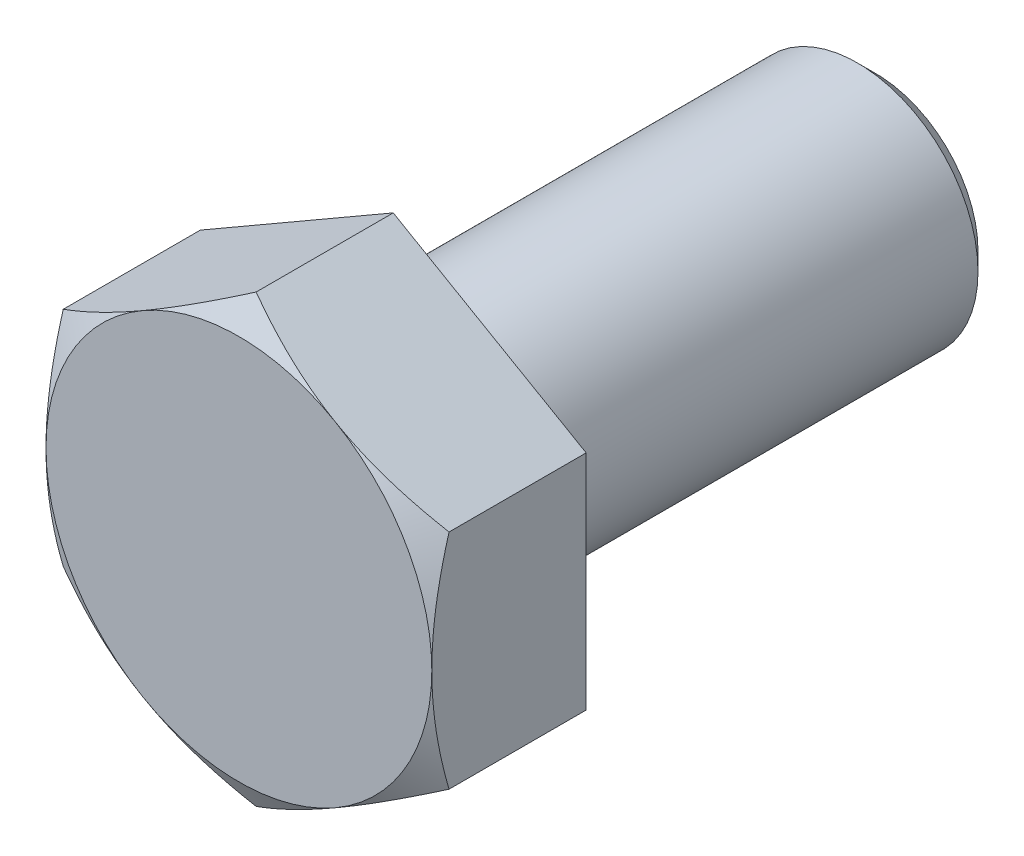
ISO-10303-21;
HEADER;
FILE_DESCRIPTION(('STEP AP214'),'2;1');
FILE_NAME('part.step','',(''),(''),'','','');
FILE_SCHEMA(('AUTOMOTIVE_DESIGN { 1 0 10303 214 1 1 1 1 }'));
ENDSEC;
DATA;
#1=APPLICATION_CONTEXT('core data for automotive mechanical design processes');
#2=APPLICATION_PROTOCOL_DEFINITION('international standard','automotive_design',2000,#1);
#3=PRODUCT_CONTEXT('',#1,'mechanical');
#4=PRODUCT('Part','Part','',(#3));
#5=PRODUCT_RELATED_PRODUCT_CATEGORY('part','',(#4));
#6=PRODUCT_DEFINITION_FORMATION('','',#4);
#7=PRODUCT_DEFINITION_CONTEXT('part definition',#1,'design');
#8=PRODUCT_DEFINITION('design','',#6,#7);
#9=PRODUCT_DEFINITION_SHAPE('','',#8);
#10=(LENGTH_UNIT() NAMED_UNIT(*) SI_UNIT(.MILLI.,.METRE.));
#11=(NAMED_UNIT(*) PLANE_ANGLE_UNIT() SI_UNIT($,.RADIAN.));
#12=(NAMED_UNIT(*) SI_UNIT($,.STERADIAN.) SOLID_ANGLE_UNIT());
#13=UNCERTAINTY_MEASURE_WITH_UNIT(LENGTH_MEASURE(1.E-05),#10,'distance_accuracy_value','');
#14=(GEOMETRIC_REPRESENTATION_CONTEXT(3) GLOBAL_UNCERTAINTY_ASSIGNED_CONTEXT((#13)) GLOBAL_UNIT_ASSIGNED_CONTEXT((#10,
#11,#12)) REPRESENTATION_CONTEXT('',''));
#15=CARTESIAN_POINT('',(0.,0.,0.));
#16=DIRECTION('',(0.,0.,1.));
#17=DIRECTION('',(1.,0.,0.));
#18=AXIS2_PLACEMENT_3D('',#15,#16,#17);
#19=CARTESIAN_POINT('',(0.,0.,6.4));
#20=DIRECTION('',(0.,0.,1.));
#21=DIRECTION('',(1.,0.,0.));
#22=AXIS2_PLACEMENT_3D('',#19,#20,#21);
#23=PLANE('',#22);
#24=CARTESIAN_POINT('',(0.,0.,6.40000000080021));
#25=DIRECTION('',(0.,0.,-1.));
#26=DIRECTION('',(-1.,0.,0.));
#27=AXIS2_PLACEMENT_3D('',#24,#25,#26);
#28=CIRCLE('',#27,8.000000000462);
#29=CARTESIAN_POINT('',(3.99982399237115,6.92830484561326,6.40000000093358));
#30=VERTEX_POINT('',#29);
#31=CARTESIAN_POINT('',(8.000000000231,0.,6.40000000093358));
#32=VERTEX_POINT('',#31);
#33=EDGE_CURVE('E382',#30,#32,#28,.T.);
#34=ORIENTED_EDGE('',*,*,#33,.F.);
#35=CARTESIAN_POINT('',(0.,0.,6.40000000080021));
#36=DIRECTION('',(0.,0.,-1.));
#37=DIRECTION('',(-1.,0.,0.));
#38=AXIS2_PLACEMENT_3D('',#35,#36,#37);
#39=CIRCLE('',#38,8.000000000462);
#40=CARTESIAN_POINT('',(-3.99982399237116,6.92830484561325,6.40000000093358));
#41=VERTEX_POINT('',#40);
#42=EDGE_CURVE('E95',#41,#30,#39,.T.);
#43=ORIENTED_EDGE('',*,*,#42,.F.);
#44=CARTESIAN_POINT('',(0.,0.,6.40000000080021));
#45=DIRECTION('',(0.,0.,-1.));
#46=DIRECTION('',(-1.,0.,0.));
#47=AXIS2_PLACEMENT_3D('',#44,#45,#46);
#48=CIRCLE('',#47,8.000000000462);
#49=CARTESIAN_POINT('',(-8.000000000231,0.,6.40000000093358));
#50=VERTEX_POINT('',#49);
#51=EDGE_CURVE('E90',#50,#41,#48,.T.);
#52=ORIENTED_EDGE('',*,*,#51,.F.);
#53=CARTESIAN_POINT('',(0.,0.,6.40000000080021));
#54=DIRECTION('',(0.,0.,-1.));
#55=DIRECTION('',(-1.,0.,0.));
#56=AXIS2_PLACEMENT_3D('',#53,#54,#55);
#57=CIRCLE('',#56,8.000000000462);
#58=CARTESIAN_POINT('',(-3.99982399237115,-6.92830484561326,6.40000000093358));
#59=VERTEX_POINT('',#58);
#60=EDGE_CURVE('E88',#59,#50,#57,.T.);
#61=ORIENTED_EDGE('',*,*,#60,.F.);
#62=CARTESIAN_POINT('',(0.,0.,6.40000000080021));
#63=DIRECTION('',(0.,0.,-1.));
#64=DIRECTION('',(-1.,0.,0.));
#65=AXIS2_PLACEMENT_3D('',#62,#63,#64);
#66=CIRCLE('',#65,8.000000000462);
#67=CARTESIAN_POINT('',(3.99982399237116,-6.92830484561325,6.40000000093358));
#68=VERTEX_POINT('',#67);
#69=EDGE_CURVE('E20',#68,#59,#66,.T.);
#70=ORIENTED_EDGE('',*,*,#69,.F.);
#71=CARTESIAN_POINT('',(0.,0.,6.40000000080021));
#72=DIRECTION('',(0.,0.,-1.));
#73=DIRECTION('',(-1.,0.,0.));
#74=AXIS2_PLACEMENT_3D('',#71,#72,#73);
#75=CIRCLE('',#74,8.000000000462);
#76=EDGE_CURVE('E107',#32,#68,#75,.T.);
#77=ORIENTED_EDGE('',*,*,#76,.F.);
#78=EDGE_LOOP('',(#34,#43,#52,#61,#70,#77));
#79=FACE_BOUND('',#78,.T.);
#80=ADVANCED_FACE('F17',(#79),#23,.T.);
#81=CARTESIAN_POINT('',(0.,0.,5.68126032397087));
#82=DIRECTION('',(0.,0.,-1.));
#83=DIRECTION('',(-1.,0.,0.));
#84=AXIS2_PLACEMENT_3D('',#81,#82,#83);
#85=CONICAL_SURFACE('',#84,9.24489363470588,1.04719755);
#86=ORIENTED_EDGE('',*,*,#69,.T.);
#87=CARTESIAN_POINT('',(-2.67896979233942E-10,-9.23746882220987,5.68554704166961));
#88=CARTESIAN_POINT('',(-0.325584578550548,-9.04950350635653,5.794096118255));
#89=CARTESIAN_POINT('',(-0.653776410234056,-8.86003298043918,5.89354561588358));
#90=CARTESIAN_POINT('',(-1.31305285292206,-8.47942187973356,6.0689225485976));
#91=CARTESIAN_POINT('',(-1.64411447140409,-8.2882945789052,6.14496628566245));
#92=CARTESIAN_POINT('',(-2.14383099095973,-7.99980003820454,6.23833483938584));
#93=CARTESIAN_POINT('',(-2.31103433936376,-7.90327080349818,6.26601951414207));
#94=CARTESIAN_POINT('',(-2.64624142221459,-7.70975025810035,6.31394221208495));
#95=CARTESIAN_POINT('',(-2.81424513548453,-7.61275895963463,6.33418043120103));
#96=CARTESIAN_POINT('',(-3.15167432024812,-7.41795555836736,6.3668546716276));
#97=CARTESIAN_POINT('',(-3.32110269530254,-7.32014177929258,6.37925101877234));
#98=CARTESIAN_POINT('',(-3.66029261261153,-7.12432187825536,6.39584083954382));
#99=CARTESIAN_POINT('',(-3.83005421417515,-7.02631572205282,6.40003268900228));
#100=CARTESIAN_POINT('',(-3.99982399223898,-6.92830484542282,6.40000000106694));
#101=B_SPLINE_CURVE_WITH_KNOTS('',3,(#87,#88,#89,#90,#91,#92,#93,#94,#95,#96,#97,#98,#99,#100),
.UNSPECIFIED.,.F.,.F.,(4,2,2,2,2,2,4),(0.,1.17438791342073,2.3428424676012,2.92783623767711,
3.51281461442965,4.10072937229669,4.68876050242769),.UNSPECIFIED.);
#102=CARTESIAN_POINT('',(-1.04692941937309E-10,-9.23746882211046,5.68554704153337));
#103=VERTEX_POINT('',#102);
#104=EDGE_CURVE('E101',#103,#59,#101,.T.);
#105=ORIENTED_EDGE('',*,*,#104,.F.);
#106=CARTESIAN_POINT('',(3.99982399219792,-6.92830484531317,6.40000000100026));
#107=CARTESIAN_POINT('',(3.83005421416783,-7.02631572200928,6.40003268897865));
#108=CARTESIAN_POINT('',(3.66029261261653,-7.1243218782397,6.39584083953782));
#109=CARTESIAN_POINT('',(3.32110269531396,-7.32014177929876,6.37925101877914));
#110=CARTESIAN_POINT('',(3.15167432025363,-7.4179555583675,6.36685467162962));
#111=CARTESIAN_POINT('',(2.81424513548439,-7.61275895963141,6.33418043119954));
#112=CARTESIAN_POINT('',(2.64624142221469,-7.70975025809979,6.31394221208476));
#113=CARTESIAN_POINT('',(2.31103433936229,-7.90327080349954,6.26601951414206));
#114=CARTESIAN_POINT('',(2.14383099095646,-7.99980003820516,6.23833483938467));
#115=CARTESIAN_POINT('',(1.64411447139829,-8.28829457891109,6.14496628566247));
#116=CARTESIAN_POINT('',(1.3130528529185,-8.47942187975287,6.0689225486046));
#117=CARTESIAN_POINT('',(0.653776410213366,-8.86003298043379,5.89354561587009));
#118=CARTESIAN_POINT('',(0.325584578510415,-9.04950350631275,5.79409611821375));
#119=CARTESIAN_POINT('',(1.84063723101252E-10,-9.23746882206464,5.68554704155982));
#120=B_SPLINE_CURVE_WITH_KNOTS('',3,(#106,#107,#108,#109,#110,#111,#112,#113,#114,#115,#116,
#117,#118,#119),.UNSPECIFIED.,.F.,.F.,(4,2,2,2,2,2,4),(0.,0.588031130139699,1.17594588801335,
1.76092426476907,2.3459180348491,3.51437258903822,4.68876050247319),.UNSPECIFIED.);
#121=EDGE_CURVE('E104',#68,#103,#120,.T.);
#122=ORIENTED_EDGE('',*,*,#121,.F.);
#123=EDGE_LOOP('',(#86,#105,#122));
#124=FACE_BOUND('',#123,.T.);
#125=ADVANCED_FACE('F99',(#124),#85,.T.);
#126=CARTESIAN_POINT('',(0.,0.,5.68114228447319));
#127=DIRECTION('',(0.,0.,-1.));
#128=DIRECTION('',(-1.,0.,0.));
#129=AXIS2_PLACEMENT_3D('',#126,#127,#128);
#130=CONICAL_SURFACE('',#129,9.2450980851126,1.04719755);
#131=ORIENTED_EDGE('',*,*,#76,.T.);
#132=CARTESIAN_POINT('',(7.99999999989974,-4.61893764459338,5.68542970618482));
#133=CARTESIAN_POINT('',(7.67438768208023,-4.80691897468416,5.79399515831159));
#134=CARTESIAN_POINT('',(7.34616767136739,-4.99640576871727,5.8934602706939));
#135=CARTESIAN_POINT('',(6.68683432337827,-5.37704972171577,6.06886543851282));
#136=CARTESIAN_POINT('',(6.35574398606141,-5.56819360242712,6.14492182499323));
#137=CARTESIAN_POINT('',(5.8559836275961,-5.85671345205885,6.23830627732571));
#138=CARTESIAN_POINT('',(5.68876550030997,-5.95325121885381,6.26599574415188));
#139=CARTESIAN_POINT('',(5.35352866211875,-6.14678894249582,6.31392681401583));
#140=CARTESIAN_POINT('',(5.18550997240664,-6.2437888871078,6.33416861311536));
#141=CARTESIAN_POINT('',(4.84805050263497,-6.43860977240732,6.3668486799905));
#142=CARTESIAN_POINT('',(4.67860681789017,-6.53643239001727,6.37924726181784));
#143=CARTESIAN_POINT('',(4.33938618577547,-6.73227002321523,6.39584008466693));
#144=CARTESIAN_POINT('',(4.16960917905948,-6.8302850730647,6.40003270065243));
#145=CARTESIAN_POINT('',(3.99982399227234,-6.92830484540357,6.40000000106694));
#146=B_SPLINE_CURVE_WITH_KNOTS('',3,(#132,#133,#134,#135,#136,#137,#138,#139,#140,#141,#142,
#143,#144,#145),.UNSPECIFIED.,.F.,.F.,(4,2,2,2,2,2,4),(0.,1.1744940243478,2.34305340576524,
2.92809986125389,3.51313091414355,4.10109897779154,4.68918346561238),.UNSPECIFIED.);
#147=CARTESIAN_POINT('',(7.99999999989526,-4.61893764440227,5.68542970604853));
#148=VERTEX_POINT('',#147);
#149=EDGE_CURVE('E117',#148,#68,#146,.T.);
#150=ORIENTED_EDGE('',*,*,#149,.F.);
#151=CARTESIAN_POINT('',(7.9999999998845,0.,6.40000000100026));
#152=CARTESIAN_POINT('',(7.99999999995853,-0.196048171180477,6.40003270062881));
#153=CARTESIAN_POINT('',(7.99999999998889,-0.392086896966271,6.39584008466093));
#154=CARTESIAN_POINT('',(8.00000000001111,-0.783779398596165,6.37924726182464));
#155=CARTESIAN_POINT('',(8.00000000000298,-0.9794332429662,6.36684867999251));
#156=CARTESIAN_POINT('',(7.99999999999704,-1.36909215931481,6.33416861311387));
#157=CARTESIAN_POINT('',(7.99999999999919,-1.5631005852858,6.31392681401565));
#158=CARTESIAN_POINT('',(8.00000000000081,-1.950193065392,6.26599574415186));
#159=CARTESIAN_POINT('',(8.0000000000003,-2.14327709505602,6.23830627732454));
#160=CARTESIAN_POINT('',(7.99999999999941,-2.72034218629831,6.14492182499325));
#161=CARTESIAN_POINT('',(7.9999999999997,-3.10264676984608,6.06886543851982));
#162=CARTESIAN_POINT('',(8.0000000000003,-3.8639681755143,5.89346027068039));
#163=CARTESIAN_POINT('',(8.0000000000006,-4.24295843995853,5.79399515827032));
#164=CARTESIAN_POINT('',(8.,-4.61893764412918,5.68542970607499));
#165=B_SPLINE_CURVE_WITH_KNOTS('',3,(#151,#152,#153,#154,#155,#156,#157,#158,#159,#160,#161,
#162,#163,#164),.UNSPECIFIED.,.F.,.F.,(4,2,2,2,2,2,4),(0.,0.588084487829552,1.17605255148414,
1.76108360437699,2.34613005986975,3.51468944129585,4.68918346565789),.UNSPECIFIED.);
#166=EDGE_CURVE('E155',#32,#148,#165,.T.);
#167=ORIENTED_EDGE('',*,*,#166,.F.);
#168=EDGE_LOOP('',(#131,#150,#167));
#169=FACE_BOUND('',#168,.T.);
#170=ADVANCED_FACE('F144',(#169),#130,.T.);
#171=CARTESIAN_POINT('',(0.,0.,5.68114228447319));
#172=DIRECTION('',(0.,0.,-1.));
#173=DIRECTION('',(-1.,0.,0.));
#174=AXIS2_PLACEMENT_3D('',#171,#172,#173);
#175=CONICAL_SURFACE('',#174,9.24509808511261,1.04719755);
#176=CARTESIAN_POINT('',(3.9998239921979,6.92830484531317,6.40000000100026));
#177=CARTESIAN_POINT('',(4.16960917902543,6.83028507303659,6.40003270062881));
#178=CARTESIAN_POINT('',(4.3393861857594,6.73227002321173,6.39584008466093));
#179=CARTESIAN_POINT('',(4.67860681788981,6.53643239003024,6.37924726182464));
#180=CARTESIAN_POINT('',(4.84805050263233,6.43860977241215,6.36684867999251));
#181=CARTESIAN_POINT('',(5.18550997240393,6.24378888710608,6.33416861311387));
#182=CARTESIAN_POINT('',(5.35352866211823,6.14678894249562,6.31392681401565));
#183=CARTESIAN_POINT('',(5.68876550031189,5.95325121885321,6.26599574415186));
#184=CARTESIAN_POINT('',(5.85598362759827,5.85671345205632,6.23830627732454));
#185=CARTESIAN_POINT('',(6.35574398606942,5.56819360242504,6.14492182499325));
#186=CARTESIAN_POINT('',(6.68683432339678,5.37704972172233,6.06886543851982));
#187=CARTESIAN_POINT('',(7.34616767137308,4.99640576869665,5.8934602706804));
#188=CARTESIAN_POINT('',(7.6743876820624,4.8069189746275,5.79399515827032));
#189=CARTESIAN_POINT('',(7.99999999981587,4.6189376444481,5.68542970607499));
#190=B_SPLINE_CURVE_WITH_KNOTS('',3,(#176,#177,#178,#179,#180,#181,#182,#183,#184,#185,#186,
#187,#188,#189),.UNSPECIFIED.,.F.,.F.,(4,2,2,2,2,2,4),(0.,0.588084487829554,1.17605255148414,
1.76108360437699,2.34613005986976,3.51468944129586,4.6891834656579),.UNSPECIFIED.);
#191=CARTESIAN_POINT('',(8.,4.61893764422086,5.68542970604853));
#192=VERTEX_POINT('',#191);
#193=EDGE_CURVE('E188',#30,#192,#190,.T.);
#194=ORIENTED_EDGE('',*,*,#193,.F.);
#195=ORIENTED_EDGE('',*,*,#33,.T.);
#196=CARTESIAN_POINT('',(8.00000000016776,4.61893764412919,5.68542970618482));
#197=CARTESIAN_POINT('',(8.0000000000586,4.24295843994565,5.79399515831159));
#198=CARTESIAN_POINT('',(8.00000000001532,3.86396817549906,5.8934602706939));
#199=CARTESIAN_POINT('',(7.99999999998476,3.10264676983332,6.06886543851282));
#200=CARTESIAN_POINT('',(7.99999999999721,2.72034218629033,6.14492182499323));
#201=CARTESIAN_POINT('',(8.0000000000014,2.14327709505287,6.23830627732571));
#202=CARTESIAN_POINT('',(8.00000000000038,1.95019306539004,6.26599574415188));
#203=CARTESIAN_POINT('',(7.99999999999962,1.56310058528615,6.31392681401583));
#204=CARTESIAN_POINT('',(7.99999999999989,1.36909215931629,6.33416861311536));
#205=CARTESIAN_POINT('',(8.00000000000011,0.979433242970895,6.3668486799905));
#206=CARTESIAN_POINT('',(8.00000000000005,0.783779398602954,6.37924726181784));
#207=CARTESIAN_POINT('',(7.99999999999995,0.392086896978424,6.39584008466693));
#208=CARTESIAN_POINT('',(7.99999999999989,0.196048171195902,6.40003270065243));
#209=CARTESIAN_POINT('',(8.,1.92506038909764E-11,6.40000000106694));
#210=B_SPLINE_CURVE_WITH_KNOTS('',3,(#196,#197,#198,#199,#200,#201,#202,#203,#204,#205,#206,
#207,#208,#209),.UNSPECIFIED.,.F.,.F.,(4,2,2,2,2,2,4),(0.,1.1744940243478,2.34305340576524,
2.92809986125389,3.51313091414356,4.10109897779154,4.68918346561239),.UNSPECIFIED.);
#211=EDGE_CURVE('E180',#192,#32,#210,.T.);
#212=ORIENTED_EDGE('',*,*,#211,.F.);
#213=EDGE_LOOP('',(#194,#195,#212));
#214=FACE_BOUND('',#213,.T.);
#215=ADVANCED_FACE('F195',(#214),#175,.T.);
#216=CARTESIAN_POINT('',(0.,0.,5.68126032397087));
#217=DIRECTION('',(0.,0.,-1.));
#218=DIRECTION('',(-1.,0.,0.));
#219=AXIS2_PLACEMENT_3D('',#216,#217,#218);
#220=CONICAL_SURFACE('',#219,9.24489363470588,1.04719755);
#221=CARTESIAN_POINT('',(-3.99982399219792,6.92830484531317,6.40000000100026));
#222=CARTESIAN_POINT('',(-3.83005421416783,7.02631572200928,6.40003268897865));
#223=CARTESIAN_POINT('',(-3.66029261261653,7.1243218782397,6.39584083953782));
#224=CARTESIAN_POINT('',(-3.32110269531396,7.32014177929876,6.37925101877914));
#225=CARTESIAN_POINT('',(-3.15167432025363,7.4179555583675,6.36685467162961));
#226=CARTESIAN_POINT('',(-2.81424513548439,7.61275895963141,6.33418043119954));
#227=CARTESIAN_POINT('',(-2.64624142221469,7.70975025809979,6.31394221208476));
#228=CARTESIAN_POINT('',(-2.31103433936229,7.90327080349954,6.26601951414206));
#229=CARTESIAN_POINT('',(-2.14383099095646,7.99980003820516,6.23833483938467));
#230=CARTESIAN_POINT('',(-1.64411447139829,8.2882945789111,6.14496628566247));
#231=CARTESIAN_POINT('',(-1.3130528529185,8.47942187975287,6.0689225486046));
#232=CARTESIAN_POINT('',(-0.653776410213366,8.8600329804338,5.89354561587008));
#233=CARTESIAN_POINT('',(-0.325584578510414,9.04950350631276,5.79409611821375));
#234=CARTESIAN_POINT('',(-1.84063428251874E-10,9.23746882206464,5.68554704155982));
#235=B_SPLINE_CURVE_WITH_KNOTS('',3,(#221,#222,#223,#224,#225,#226,#227,#228,#229,#230,#231,
#232,#233,#234),.UNSPECIFIED.,.F.,.F.,(4,2,2,2,2,2,4),(0.,0.588031130139699,1.17594588801335,
1.76092426476907,2.3459180348491,3.51437258903823,4.68876050247319),.UNSPECIFIED.);
#236=CARTESIAN_POINT('',(1.04690850912455E-10,9.23746882211046,5.68554704153337));
#237=VERTEX_POINT('',#236);
#238=EDGE_CURVE('E213',#41,#237,#235,.T.);
#239=ORIENTED_EDGE('',*,*,#238,.F.);
#240=ORIENTED_EDGE('',*,*,#42,.T.);
#241=CARTESIAN_POINT('',(2.67895619954215E-10,9.23746882220987,5.68554704166961));
#242=CARTESIAN_POINT('',(0.325584578550546,9.04950350635653,5.79409611825501));
#243=CARTESIAN_POINT('',(0.653776410234054,8.86003298043918,5.89354561588358));
#244=CARTESIAN_POINT('',(1.31305285292206,8.47942187973356,6.0689225485976));
#245=CARTESIAN_POINT('',(1.64411447140408,8.2882945789052,6.14496628566245));
#246=CARTESIAN_POINT('',(2.14383099095972,7.99980003820454,6.23833483938584));
#247=CARTESIAN_POINT('',(2.31103433936376,7.90327080349818,6.26601951414208));
#248=CARTESIAN_POINT('',(2.64624142221459,7.70975025810035,6.31394221208495));
#249=CARTESIAN_POINT('',(2.81424513548453,7.61275895963463,6.33418043120103));
#250=CARTESIAN_POINT('',(3.15167432024812,7.41795555836736,6.3668546716276));
#251=CARTESIAN_POINT('',(3.32110269530254,7.32014177929258,6.37925101877234));
#252=CARTESIAN_POINT('',(3.66029261261152,7.12432187825535,6.39584083954382));
#253=CARTESIAN_POINT('',(3.83005421417514,7.02631572205282,6.40003268900228));
#254=CARTESIAN_POINT('',(3.99982399223898,6.92830484542282,6.40000000106695));
#255=B_SPLINE_CURVE_WITH_KNOTS('',3,(#241,#242,#243,#244,#245,#246,#247,#248,#249,#250,#251,
#252,#253,#254),.UNSPECIFIED.,.F.,.F.,(4,2,2,2,2,2,4),(0.,1.17438791342073,2.3428424676012,
2.92783623767711,3.51281461442965,4.10072937229669,4.68876050242769),.UNSPECIFIED.);
#256=EDGE_CURVE('E207',#237,#30,#255,.T.);
#257=ORIENTED_EDGE('',*,*,#256,.F.);
#258=EDGE_LOOP('',(#239,#240,#257));
#259=FACE_BOUND('',#258,.T.);
#260=ADVANCED_FACE('F199',(#259),#220,.T.);
#261=CARTESIAN_POINT('',(0.,0.,5.68114228447319));
#262=DIRECTION('',(0.,0.,-1.));
#263=DIRECTION('',(-1.,0.,0.));
#264=AXIS2_PLACEMENT_3D('',#261,#262,#263);
#265=CONICAL_SURFACE('',#264,9.24509808511261,1.04719755);
#266=ORIENTED_EDGE('',*,*,#60,.T.);
#267=CARTESIAN_POINT('',(-8.00000000016775,-4.61893764412919,5.68542970618482));
#268=CARTESIAN_POINT('',(-8.00000000005859,-4.24295843994565,5.79399515831159));
#269=CARTESIAN_POINT('',(-8.00000000001531,-3.86396817549907,5.8934602706939));
#270=CARTESIAN_POINT('',(-7.99999999998476,-3.10264676983333,6.06886543851282));
#271=CARTESIAN_POINT('',(-7.99999999999721,-2.72034218629033,6.14492182499323));
#272=CARTESIAN_POINT('',(-8.0000000000014,-2.14327709505287,6.23830627732571));
#273=CARTESIAN_POINT('',(-8.00000000000037,-1.95019306539004,6.26599574415188));
#274=CARTESIAN_POINT('',(-7.99999999999962,-1.56310058528615,6.31392681401583));
#275=CARTESIAN_POINT('',(-7.99999999999989,-1.36909215931629,6.33416861311536));
#276=CARTESIAN_POINT('',(-8.00000000000011,-0.979433242970896,6.3668486799905));
#277=CARTESIAN_POINT('',(-8.00000000000005,-0.783779398602955,6.37924726181784));
#278=CARTESIAN_POINT('',(-7.99999999999994,-0.392086896978426,6.39584008466693));
#279=CARTESIAN_POINT('',(-7.99999999999989,-0.196048171195904,6.40003270065244));
#280=CARTESIAN_POINT('',(-8.,-1.92523564045291E-11,6.40000000106695));
#281=B_SPLINE_CURVE_WITH_KNOTS('',3,(#267,#268,#269,#270,#271,#272,#273,#274,#275,#276,#277,
#278,#279,#280),.UNSPECIFIED.,.F.,.F.,(4,2,2,2,2,2,4),(0.,1.1744940243478,2.34305340576524,
2.92809986125389,3.51313091414356,4.10109897779154,4.68918346561239),.UNSPECIFIED.);
#282=CARTESIAN_POINT('',(-7.99999999989526,-4.61893764428133,5.68542970608344));
#283=VERTEX_POINT('',#282);
#284=EDGE_CURVE('E112',#283,#50,#281,.T.);
#285=ORIENTED_EDGE('',*,*,#284,.F.);
#286=CARTESIAN_POINT('',(-3.99982399219791,-6.92830484531317,6.40000000100026));
#287=CARTESIAN_POINT('',(-4.16960917902543,-6.8302850730366,6.40003270062881));
#288=CARTESIAN_POINT('',(-4.3393861857594,-6.73227002321173,6.39584008466093));
#289=CARTESIAN_POINT('',(-4.67860681788981,-6.53643239003024,6.37924726182464));
#290=CARTESIAN_POINT('',(-4.84805050263233,-6.43860977241216,6.36684867999251));
#291=CARTESIAN_POINT('',(-5.18550997240393,-6.24378888710608,6.33416861311387));
#292=CARTESIAN_POINT('',(-5.35352866211823,-6.14678894249562,6.31392681401565));
#293=CARTESIAN_POINT('',(-5.68876550031189,-5.95325121885322,6.26599574415186));
#294=CARTESIAN_POINT('',(-5.85598362759827,-5.85671345205632,6.23830627732454));
#295=CARTESIAN_POINT('',(-6.35574398606942,-5.56819360242504,6.14492182499325));
#296=CARTESIAN_POINT('',(-6.68683432339678,-5.37704972172234,6.06886543851982));
#297=CARTESIAN_POINT('',(-7.34616767137307,-4.99640576869666,5.89346027068039));
#298=CARTESIAN_POINT('',(-7.67438768206239,-4.8069189746275,5.79399515827032));
#299=CARTESIAN_POINT('',(-7.99999999981586,-4.61893764444811,5.68542970607499));
#300=B_SPLINE_CURVE_WITH_KNOTS('',3,(#286,#287,#288,#289,#290,#291,#292,#293,#294,#295,#296,
#297,#298,#299),.UNSPECIFIED.,.F.,.F.,(4,2,2,2,2,2,4),(0.,0.588084487829553,1.17605255148414,
1.76108360437699,2.34613005986976,3.51468944129586,4.6891834656579),.UNSPECIFIED.);
#301=EDGE_CURVE('E109',#59,#283,#300,.T.);
#302=ORIENTED_EDGE('',*,*,#301,.F.);
#303=EDGE_LOOP('',(#266,#285,#302));
#304=FACE_BOUND('',#303,.T.);
#305=ADVANCED_FACE('F110',(#304),#265,.T.);
#306=CARTESIAN_POINT('',(0.,0.,5.68114228447319));
#307=DIRECTION('',(0.,0.,-1.));
#308=DIRECTION('',(-1.,0.,0.));
#309=AXIS2_PLACEMENT_3D('',#306,#307,#308);
#310=CONICAL_SURFACE('',#309,9.2450980851126,1.04719755);
#311=ORIENTED_EDGE('',*,*,#51,.T.);
#312=CARTESIAN_POINT('',(-7.99999999989974,4.61893764459338,5.68542970618483));
#313=CARTESIAN_POINT('',(-7.67438768208023,4.80691897468416,5.79399515831159));
#314=CARTESIAN_POINT('',(-7.34616767136739,4.99640576871727,5.8934602706939));
#315=CARTESIAN_POINT('',(-6.68683432337827,5.37704972171577,6.06886543851282));
#316=CARTESIAN_POINT('',(-6.35574398606141,5.56819360242712,6.14492182499323));
#317=CARTESIAN_POINT('',(-5.8559836275961,5.85671345205885,6.23830627732571));
#318=CARTESIAN_POINT('',(-5.68876550030997,5.95325121885381,6.26599574415188));
#319=CARTESIAN_POINT('',(-5.35352866211876,6.14678894249582,6.31392681401583));
#320=CARTESIAN_POINT('',(-5.18550997240664,6.2437888871078,6.33416861311536));
#321=CARTESIAN_POINT('',(-4.84805050263497,6.43860977240732,6.3668486799905));
#322=CARTESIAN_POINT('',(-4.67860681789018,6.53643239001727,6.37924726181784));
#323=CARTESIAN_POINT('',(-4.33938618577547,6.73227002321523,6.39584008466693));
#324=CARTESIAN_POINT('',(-4.16960917905948,6.8302850730647,6.40003270065243));
#325=CARTESIAN_POINT('',(-3.99982399227234,6.92830484540357,6.40000000106694));
#326=B_SPLINE_CURVE_WITH_KNOTS('',3,(#312,#313,#314,#315,#316,#317,#318,#319,#320,#321,#322,
#323,#324,#325),.UNSPECIFIED.,.F.,.F.,(4,2,2,2,2,2,4),(0.,1.1744940243478,2.34305340576524,
2.92809986125389,3.51313091414355,4.10109897779154,4.68918346561238),.UNSPECIFIED.);
#327=CARTESIAN_POINT('',(-7.99999999989526,4.61893764440226,5.68542970604853));
#328=VERTEX_POINT('',#327);
#329=EDGE_CURVE('E222',#328,#41,#326,.T.);
#330=ORIENTED_EDGE('',*,*,#329,.F.);
#331=CARTESIAN_POINT('',(-7.9999999998845,0.,6.40000000100026));
#332=CARTESIAN_POINT('',(-7.99999999995853,0.196048171180476,6.40003270062881));
#333=CARTESIAN_POINT('',(-7.99999999998889,0.39208689696627,6.39584008466093));
#334=CARTESIAN_POINT('',(-8.00000000001111,0.783779398596164,6.37924726182464));
#335=CARTESIAN_POINT('',(-8.00000000000297,0.979433242966199,6.36684867999251));
#336=CARTESIAN_POINT('',(-7.99999999999704,1.36909215931481,6.33416861311387));
#337=CARTESIAN_POINT('',(-7.99999999999918,1.5631005852858,6.31392681401565));
#338=CARTESIAN_POINT('',(-8.00000000000081,1.950193065392,6.26599574415186));
#339=CARTESIAN_POINT('',(-8.00000000000029,2.14327709505601,6.23830627732454));
#340=CARTESIAN_POINT('',(-7.99999999999941,2.7203421862983,6.14492182499325));
#341=CARTESIAN_POINT('',(-7.9999999999997,3.10264676984607,6.06886543851983));
#342=CARTESIAN_POINT('',(-8.0000000000003,3.8639681755143,5.8934602706804));
#343=CARTESIAN_POINT('',(-8.0000000000006,4.24295843995852,5.79399515827032));
#344=CARTESIAN_POINT('',(-8.,4.61893764412918,5.685429706075));
#345=B_SPLINE_CURVE_WITH_KNOTS('',3,(#331,#332,#333,#334,#335,#336,#337,#338,#339,#340,#341,
#342,#343,#344),.UNSPECIFIED.,.F.,.F.,(4,2,2,2,2,2,4),(0.,0.588084487829552,1.17605255148414,
1.76108360437699,2.34613005986975,3.51468944129585,4.68918346565789),.UNSPECIFIED.);
#346=EDGE_CURVE('E242',#50,#328,#345,.T.);
#347=ORIENTED_EDGE('',*,*,#346,.F.);
#348=EDGE_LOOP('',(#311,#330,#347));
#349=FACE_BOUND('',#348,.T.);
#350=ADVANCED_FACE('F448',(#349),#310,.T.);
#351=CARTESIAN_POINT('',(0.,-9.2374688221709,0.));
#352=DIRECTION('',(-0.499977999031957,-0.86603810567665,0.));
#353=DIRECTION('',(0.86603810567665,-0.499977999031957,0.));
#354=AXIS2_PLACEMENT_3D('',#351,#352,#353);
#355=PLANE('',#354);
#356=DIRECTION('',(0.86603810567665,-0.499977999031957,0.));
#357=VECTOR('',#356,1.);
#358=CARTESIAN_POINT('',(-8.,-4.61893764434181,0.));
#359=LINE('',#358,#357);
#360=CARTESIAN_POINT('',(-8.,-4.61893764434181,0.));
#361=VERTEX_POINT('',#360);
#362=CARTESIAN_POINT('',(0.,-9.2374688221709,0.));
#363=VERTEX_POINT('',#362);
#364=EDGE_CURVE('E289',#361,#363,#359,.T.);
#365=ORIENTED_EDGE('',*,*,#364,.T.);
#366=DIRECTION('',(0.,0.,1.));
#367=VECTOR('',#366,1.);
#368=CARTESIAN_POINT('',(0.,-9.2374688221709,0.));
#369=LINE('',#368,#367);
#370=EDGE_CURVE('E121',#103,#363,#369,.F.);
#371=ORIENTED_EDGE('',*,*,#370,.F.);
#372=ORIENTED_EDGE('',*,*,#104,.T.);
#373=ORIENTED_EDGE('',*,*,#301,.T.);
#374=DIRECTION('',(0.,0.,1.));
#375=VECTOR('',#374,1.);
#376=CARTESIAN_POINT('',(-8.,-4.61893764434181,0.));
#377=LINE('',#376,#375);
#378=EDGE_CURVE('E293',#361,#283,#377,.T.);
#379=ORIENTED_EDGE('',*,*,#378,.F.);
#380=EDGE_LOOP('',(#365,#371,#372,#373,#379));
#381=FACE_BOUND('',#380,.T.);
#382=ADVANCED_FACE('F119',(#381),#355,.T.);
#383=CARTESIAN_POINT('',(8.,-4.6189376443418,0.));
#384=DIRECTION('',(0.499977999031958,-0.86603810567665,0.));
#385=DIRECTION('',(0.86603810567665,0.499977999031958,0.));
#386=AXIS2_PLACEMENT_3D('',#383,#384,#385);
#387=PLANE('',#386);
#388=DIRECTION('',(0.866038105676649,0.499977999031958,0.));
#389=VECTOR('',#388,1.);
#390=CARTESIAN_POINT('',(0.,-9.2374688221709,0.));
#391=LINE('',#390,#389);
#392=CARTESIAN_POINT('',(8.,-4.6189376443418,0.));
#393=VERTEX_POINT('',#392);
#394=EDGE_CURVE('E292',#363,#393,#391,.T.);
#395=ORIENTED_EDGE('',*,*,#394,.T.);
#396=DIRECTION('',(0.,0.,-1.));
#397=VECTOR('',#396,1.);
#398=CARTESIAN_POINT('',(8.,-4.6189376443418,0.));
#399=LINE('',#398,#397);
#400=EDGE_CURVE('E189',#148,#393,#399,.T.);
#401=ORIENTED_EDGE('',*,*,#400,.F.);
#402=ORIENTED_EDGE('',*,*,#149,.T.);
#403=ORIENTED_EDGE('',*,*,#121,.T.);
#404=ORIENTED_EDGE('',*,*,#370,.T.);
#405=EDGE_LOOP('',(#395,#401,#402,#403,#404));
#406=FACE_BOUND('',#405,.T.);
#407=ADVANCED_FACE('F166',(#406),#387,.T.);
#408=CARTESIAN_POINT('',(8.,4.61893764434181,0.));
#409=DIRECTION('',(1.,0.,0.));
#410=DIRECTION('',(0.,0.,-1.));
#411=AXIS2_PLACEMENT_3D('',#408,#409,#410);
#412=PLANE('',#411);
#413=DIRECTION('',(0.,0.,1.));
#414=VECTOR('',#413,1.);
#415=CARTESIAN_POINT('',(8.,4.6189376443418,0.));
#416=LINE('',#415,#414);
#417=CARTESIAN_POINT('',(8.,4.6189376443418,0.));
#418=VERTEX_POINT('',#417);
#419=EDGE_CURVE('E267',#192,#418,#416,.F.);
#420=ORIENTED_EDGE('',*,*,#419,.F.);
#421=ORIENTED_EDGE('',*,*,#211,.T.);
#422=ORIENTED_EDGE('',*,*,#166,.T.);
#423=ORIENTED_EDGE('',*,*,#400,.T.);
#424=DIRECTION('',(0.,1.,0.));
#425=VECTOR('',#424,1.);
#426=CARTESIAN_POINT('',(8.,0.,0.));
#427=LINE('',#426,#425);
#428=EDGE_CURVE('E303',#393,#418,#427,.T.);
#429=ORIENTED_EDGE('',*,*,#428,.T.);
#430=EDGE_LOOP('',(#420,#421,#422,#423,#429));
#431=FACE_BOUND('',#430,.T.);
#432=ADVANCED_FACE('F169',(#431),#412,.T.);
#433=CARTESIAN_POINT('',(0.,9.2374688221709,0.));
#434=DIRECTION('',(0.499977999031957,0.86603810567665,0.));
#435=DIRECTION('',(-0.86603810567665,0.499977999031957,0.));
#436=AXIS2_PLACEMENT_3D('',#433,#434,#435);
#437=PLANE('',#436);
#438=DIRECTION('',(0.,0.,1.));
#439=VECTOR('',#438,1.);
#440=CARTESIAN_POINT('',(0.,9.2374688221709,0.));
#441=LINE('',#440,#439);
#442=CARTESIAN_POINT('',(0.,9.2374688221709,0.));
#443=VERTEX_POINT('',#442);
#444=EDGE_CURVE('E221',#237,#443,#441,.F.);
#445=ORIENTED_EDGE('',*,*,#444,.F.);
#446=ORIENTED_EDGE('',*,*,#256,.T.);
#447=ORIENTED_EDGE('',*,*,#193,.T.);
#448=ORIENTED_EDGE('',*,*,#419,.T.);
#449=DIRECTION('',(-0.86603810567665,0.499977999031956,0.));
#450=VECTOR('',#449,1.);
#451=CARTESIAN_POINT('',(8.,4.61893764434181,0.));
#452=LINE('',#451,#450);
#453=EDGE_CURVE('E298',#418,#443,#452,.T.);
#454=ORIENTED_EDGE('',*,*,#453,.T.);
#455=EDGE_LOOP('',(#445,#446,#447,#448,#454));
#456=FACE_BOUND('',#455,.T.);
#457=ADVANCED_FACE('F175',(#456),#437,.T.);
#458=CARTESIAN_POINT('',(-8.,4.61893764434179,0.));
#459=DIRECTION('',(-0.499977999031958,0.866038105676649,0.));
#460=DIRECTION('',(-0.866038105676649,-0.499977999031958,0.));
#461=AXIS2_PLACEMENT_3D('',#458,#459,#460);
#462=PLANE('',#461);
#463=DIRECTION('',(0.,0.,1.));
#464=VECTOR('',#463,1.);
#465=CARTESIAN_POINT('',(-8.,4.61893764434179,0.));
#466=LINE('',#465,#464);
#467=CARTESIAN_POINT('',(-8.,4.61893764434179,0.));
#468=VERTEX_POINT('',#467);
#469=EDGE_CURVE('E256',#328,#468,#466,.F.);
#470=ORIENTED_EDGE('',*,*,#469,.F.);
#471=ORIENTED_EDGE('',*,*,#329,.T.);
#472=ORIENTED_EDGE('',*,*,#238,.T.);
#473=ORIENTED_EDGE('',*,*,#444,.T.);
#474=DIRECTION('',(-0.86603810567665,-0.499977999031958,0.));
#475=VECTOR('',#474,1.);
#476=CARTESIAN_POINT('',(0.,9.2374688221709,0.));
#477=LINE('',#476,#475);
#478=EDGE_CURVE('E36',#443,#468,#477,.T.);
#479=ORIENTED_EDGE('',*,*,#478,.T.);
#480=EDGE_LOOP('',(#470,#471,#472,#473,#479));
#481=FACE_BOUND('',#480,.T.);
#482=ADVANCED_FACE('F228',(#481),#462,.T.);
#483=CARTESIAN_POINT('',(-8.,-4.61893764434181,0.));
#484=DIRECTION('',(-1.,0.,0.));
#485=DIRECTION('',(0.,0.,1.));
#486=AXIS2_PLACEMENT_3D('',#483,#484,#485);
#487=PLANE('',#486);
#488=DIRECTION('',(0.,1.,0.));
#489=VECTOR('',#488,1.);
#490=CARTESIAN_POINT('',(-8.,0.,0.));
#491=LINE('',#490,#489);
#492=EDGE_CURVE('E282',#468,#361,#491,.F.);
#493=ORIENTED_EDGE('',*,*,#492,.T.);
#494=ORIENTED_EDGE('',*,*,#378,.T.);
#495=ORIENTED_EDGE('',*,*,#284,.T.);
#496=ORIENTED_EDGE('',*,*,#346,.T.);
#497=ORIENTED_EDGE('',*,*,#469,.T.);
#498=EDGE_LOOP('',(#493,#494,#495,#496,#497));
#499=FACE_BOUND('',#498,.T.);
#500=ADVANCED_FACE('F232',(#499),#487,.T.);
#501=CARTESIAN_POINT('',(0.,-2.5,-20.));
#502=DIRECTION('',(0.,0.,-1.));
#503=DIRECTION('',(-1.,0.,0.));
#504=AXIS2_PLACEMENT_3D('',#501,#502,#503);
#505=PLANE('',#504);
#506=CARTESIAN_POINT('',(0.,0.,-20.0000000003797));
#507=DIRECTION('',(0.,0.,1.));
#508=DIRECTION('',(1.,0.,0.));
#509=AXIS2_PLACEMENT_3D('',#506,#507,#508);
#510=CIRCLE('',#509,4.25000000035425);
#511=CARTESIAN_POINT('',(4.25000000035425,0.,-20.0000000003797));
#512=VERTEX_POINT('',#511);
#513=EDGE_CURVE('E286',#512,#512,#510,.T.);
#514=ORIENTED_EDGE('',*,*,#513,.F.);
#515=EDGE_LOOP('',(#514));
#516=FACE_BOUND('',#515,.T.);
#517=ADVANCED_FACE('F237',(#516),#505,.T.);
#518=CARTESIAN_POINT('',(0.,0.,0.));
#519=DIRECTION('',(0.,0.,1.));
#520=DIRECTION('',(1.,0.,0.));
#521=AXIS2_PLACEMENT_3D('',#518,#519,#520);
#522=PLANE('',#521);
#523=CARTESIAN_POINT('',(0.,0.,0.));
#524=DIRECTION('',(0.,0.,-1.));
#525=DIRECTION('',(0.,-1.,0.));
#526=AXIS2_PLACEMENT_3D('',#523,#524,#525);
#527=CIRCLE('',#526,5.40000000000001);
#528=CARTESIAN_POINT('',(0.,-5.40000000000001,0.));
#529=VERTEX_POINT('',#528);
#530=EDGE_CURVE('E315',#529,#529,#527,.F.);
#531=ORIENTED_EDGE('',*,*,#530,.T.);
#532=EDGE_LOOP('',(#531));
#533=FACE_BOUND('',#532,.T.);
#534=ORIENTED_EDGE('',*,*,#478,.F.);
#535=ORIENTED_EDGE('',*,*,#453,.F.);
#536=ORIENTED_EDGE('',*,*,#428,.F.);
#537=ORIENTED_EDGE('',*,*,#394,.F.);
#538=ORIENTED_EDGE('',*,*,#364,.F.);
#539=ORIENTED_EDGE('',*,*,#492,.F.);
#540=EDGE_LOOP('',(#534,#535,#536,#537,#538,#539));
#541=FACE_BOUND('',#540,.T.);
#542=ADVANCED_FACE('F361',(#533,#541),#522,.F.);
#543=CARTESIAN_POINT('',(0.,0.,-19.2499999997722));
#544=DIRECTION('',(0.,0.,1.));
#545=DIRECTION('',(1.,0.,0.));
#546=AXIS2_PLACEMENT_3D('',#543,#544,#545);
#547=CONICAL_SURFACE('',#546,4.99999999959755,0.785398162487954);
#548=ORIENTED_EDGE('',*,*,#513,.T.);
#549=EDGE_LOOP('',(#548));
#550=FACE_BOUND('',#549,.T.);
#551=CARTESIAN_POINT('',(0.,0.,-19.25));
#552=DIRECTION('',(0.,0.,-1.));
#553=DIRECTION('',(-1.,0.,0.));
#554=AXIS2_PLACEMENT_3D('',#551,#552,#553);
#555=CIRCLE('',#554,5.00000000000001);
#556=CARTESIAN_POINT('',(-5.00000000000001,0.,-19.25));
#557=VERTEX_POINT('',#556);
#558=EDGE_CURVE('E27',#557,#557,#555,.F.);
#559=ORIENTED_EDGE('',*,*,#558,.F.);
#560=EDGE_LOOP('',(#559));
#561=FACE_BOUND('',#560,.T.);
#562=ADVANCED_FACE('F342',(#550,#561),#547,.T.);
#563=CARTESIAN_POINT('',(0.,0.,-0.4));
#564=DIRECTION('',(0.,0.,1.));
#565=DIRECTION('',(1.,0.,0.));
#566=AXIS2_PLACEMENT_3D('',#563,#564,#565);
#567=TOROIDAL_SURFACE('',#566,5.40000000000001,0.4);
#568=ORIENTED_EDGE('',*,*,#530,.F.);
#569=EDGE_LOOP('',(#568));
#570=FACE_BOUND('',#569,.T.);
#571=CARTESIAN_POINT('',(0.,0.,-0.399999999999999));
#572=DIRECTION('',(0.,0.,-1.));
#573=DIRECTION('',(-1.,0.,0.));
#574=AXIS2_PLACEMENT_3D('',#571,#572,#573);
#575=CIRCLE('',#574,5.00000000000001);
#576=CARTESIAN_POINT('',(-5.00000000000001,0.,-0.399999999999999));
#577=VERTEX_POINT('',#576);
#578=EDGE_CURVE('E11',#577,#577,#575,.T.);
#579=ORIENTED_EDGE('',*,*,#578,.F.);
#580=EDGE_LOOP('',(#579));
#581=FACE_BOUND('',#580,.T.);
#582=ADVANCED_FACE('F336',(#570,#581),#567,.F.);
#583=CARTESIAN_POINT('',(0.,0.,-10.));
#584=DIRECTION('',(0.,0.,-1.));
#585=DIRECTION('',(-1.,0.,0.));
#586=AXIS2_PLACEMENT_3D('',#583,#584,#585);
#587=CYLINDRICAL_SURFACE('',#586,5.00000000000001);
#588=ORIENTED_EDGE('',*,*,#578,.T.);
#589=EDGE_LOOP('',(#588));
#590=FACE_BOUND('',#589,.T.);
#591=ORIENTED_EDGE('',*,*,#558,.T.);
#592=EDGE_LOOP('',(#591));
#593=FACE_BOUND('',#592,.T.);
#594=ADVANCED_FACE('F341',(#590,#593),#587,.T.);
#595=CLOSED_SHELL('',(#80,#125,#170,#215,#260,#305,#350,#382,#407,#432,#457,#482,#500,#517,#542,
#562,#582,#594));
#596=MANIFOLD_SOLID_BREP('B1',#595);
#597=ADVANCED_BREP_SHAPE_REPRESENTATION('',(#18,#596),#14);
#598=SHAPE_DEFINITION_REPRESENTATION(#9,#597);
ENDSEC;
END-ISO-10303-21;
